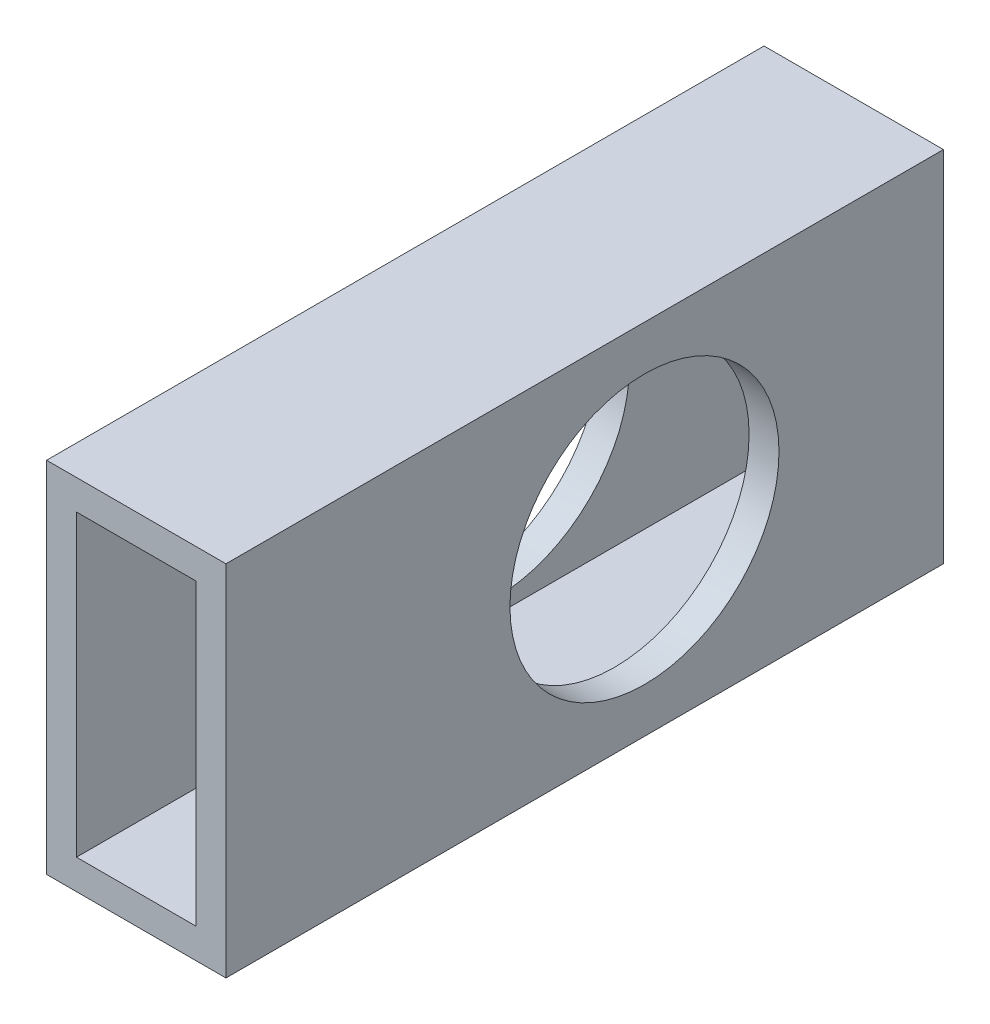
ISO-10303-21;
HEADER;
FILE_DESCRIPTION(('STEP AP214'),'2;1');
FILE_NAME('part.step','',(''),(''),'','','');
FILE_SCHEMA(('AUTOMOTIVE_DESIGN { 1 0 10303 214 1 1 1 1 }'));
ENDSEC;
DATA;
#1=APPLICATION_CONTEXT('core data for automotive mechanical design processes');
#2=APPLICATION_PROTOCOL_DEFINITION('international standard','automotive_design',2000,#1);
#3=PRODUCT_CONTEXT('',#1,'mechanical');
#4=PRODUCT('Part','Part','',(#3));
#5=PRODUCT_RELATED_PRODUCT_CATEGORY('part','',(#4));
#6=PRODUCT_DEFINITION_FORMATION('','',#4);
#7=PRODUCT_DEFINITION_CONTEXT('part definition',#1,'design');
#8=PRODUCT_DEFINITION('design','',#6,#7);
#9=PRODUCT_DEFINITION_SHAPE('','',#8);
#10=(LENGTH_UNIT() NAMED_UNIT(*) SI_UNIT(.MILLI.,.METRE.));
#11=(NAMED_UNIT(*) PLANE_ANGLE_UNIT() SI_UNIT($,.RADIAN.));
#12=(NAMED_UNIT(*) SI_UNIT($,.STERADIAN.) SOLID_ANGLE_UNIT());
#13=UNCERTAINTY_MEASURE_WITH_UNIT(LENGTH_MEASURE(1.E-05),#10,'distance_accuracy_value','');
#14=(GEOMETRIC_REPRESENTATION_CONTEXT(3) GLOBAL_UNCERTAINTY_ASSIGNED_CONTEXT((#13)) GLOBAL_UNIT_ASSIGNED_CONTEXT((#10,
#11,#12)) REPRESENTATION_CONTEXT('',''));
#15=CARTESIAN_POINT('',(0.,0.,0.));
#16=DIRECTION('',(0.,0.,1.));
#17=DIRECTION('',(1.,0.,0.));
#18=AXIS2_PLACEMENT_3D('',#15,#16,#17);
#19=CARTESIAN_POINT('',(0.,0.,76.2));
#20=DIRECTION('',(0.,0.,1.));
#21=DIRECTION('',(1.,0.,0.));
#22=AXIS2_PLACEMENT_3D('',#19,#20,#21);
#23=PLANE('',#22);
#24=DIRECTION('',(0.,-1.,0.));
#25=VECTOR('',#24,1.);
#26=CARTESIAN_POINT('',(0.,0.,76.2));
#27=LINE('',#26,#25);
#28=CARTESIAN_POINT('',(0.,38.1,76.2));
#29=VERTEX_POINT('',#28);
#30=CARTESIAN_POINT('',(0.,0.,76.2));
#31=VERTEX_POINT('',#30);
#32=EDGE_CURVE('E161',#29,#31,#27,.T.);
#33=ORIENTED_EDGE('',*,*,#32,.T.);
#34=DIRECTION('',(1.,0.,0.));
#35=VECTOR('',#34,1.);
#36=CARTESIAN_POINT('',(0.,0.,76.2));
#37=LINE('',#36,#35);
#38=CARTESIAN_POINT('',(19.05,0.,76.2));
#39=VERTEX_POINT('',#38);
#40=EDGE_CURVE('E164',#31,#39,#37,.T.);
#41=ORIENTED_EDGE('',*,*,#40,.T.);
#42=DIRECTION('',(0.,1.,0.));
#43=VECTOR('',#42,1.);
#44=CARTESIAN_POINT('',(19.05,0.,76.2));
#45=LINE('',#44,#43);
#46=CARTESIAN_POINT('',(19.05,38.1,76.2));
#47=VERTEX_POINT('',#46);
#48=EDGE_CURVE('E167',#39,#47,#45,.T.);
#49=ORIENTED_EDGE('',*,*,#48,.T.);
#50=DIRECTION('',(-1.,0.,0.));
#51=VECTOR('',#50,1.);
#52=CARTESIAN_POINT('',(0.,38.1,76.2));
#53=LINE('',#52,#51);
#54=EDGE_CURVE('E169',#47,#29,#53,.T.);
#55=ORIENTED_EDGE('',*,*,#54,.T.);
#56=EDGE_LOOP('',(#33,#41,#49,#55));
#57=FACE_BOUND('',#56,.T.);
#58=DIRECTION('',(1.,0.,0.));
#59=VECTOR('',#58,1.);
#60=CARTESIAN_POINT('',(0.,3.175,76.2));
#61=LINE('',#60,#59);
#62=CARTESIAN_POINT('',(3.175,3.175,76.2));
#63=VERTEX_POINT('',#62);
#64=CARTESIAN_POINT('',(15.875,3.175,76.2));
#65=VERTEX_POINT('',#64);
#66=EDGE_CURVE('E131',#63,#65,#61,.T.);
#67=ORIENTED_EDGE('',*,*,#66,.F.);
#68=DIRECTION('',(0.,-1.,0.));
#69=VECTOR('',#68,1.);
#70=CARTESIAN_POINT('',(3.175,0.,76.2));
#71=LINE('',#70,#69);
#72=CARTESIAN_POINT('',(3.175,34.925,76.2));
#73=VERTEX_POINT('',#72);
#74=EDGE_CURVE('E123',#73,#63,#71,.T.);
#75=ORIENTED_EDGE('',*,*,#74,.F.);
#76=DIRECTION('',(-1.,0.,0.));
#77=VECTOR('',#76,1.);
#78=CARTESIAN_POINT('',(0.,34.925,76.2));
#79=LINE('',#78,#77);
#80=CARTESIAN_POINT('',(15.875,34.925,76.2));
#81=VERTEX_POINT('',#80);
#82=EDGE_CURVE('E145',#81,#73,#79,.T.);
#83=ORIENTED_EDGE('',*,*,#82,.F.);
#84=DIRECTION('',(0.,1.,0.));
#85=VECTOR('',#84,1.);
#86=CARTESIAN_POINT('',(15.875,0.,76.2));
#87=LINE('',#86,#85);
#88=EDGE_CURVE('E143',#65,#81,#87,.T.);
#89=ORIENTED_EDGE('',*,*,#88,.F.);
#90=EDGE_LOOP('',(#67,#75,#83,#89));
#91=FACE_BOUND('',#90,.T.);
#92=ADVANCED_FACE('F57',(#57,#91),#23,.T.);
#93=CARTESIAN_POINT('',(0.,0.,0.));
#94=DIRECTION('',(0.,0.,1.));
#95=DIRECTION('',(1.,0.,0.));
#96=AXIS2_PLACEMENT_3D('',#93,#94,#95);
#97=PLANE('',#96);
#98=DIRECTION('',(0.,-1.,0.));
#99=VECTOR('',#98,1.);
#100=CARTESIAN_POINT('',(0.,0.,0.));
#101=LINE('',#100,#99);
#102=CARTESIAN_POINT('',(0.,38.1,0.));
#103=VERTEX_POINT('',#102);
#104=CARTESIAN_POINT('',(0.,0.,0.));
#105=VERTEX_POINT('',#104);
#106=EDGE_CURVE('E139',#103,#105,#101,.T.);
#107=ORIENTED_EDGE('',*,*,#106,.F.);
#108=DIRECTION('',(-1.,0.,0.));
#109=VECTOR('',#108,1.);
#110=CARTESIAN_POINT('',(0.,38.1,0.));
#111=LINE('',#110,#109);
#112=CARTESIAN_POINT('',(19.05,38.1,0.));
#113=VERTEX_POINT('',#112);
#114=EDGE_CURVE('E165',#113,#103,#111,.T.);
#115=ORIENTED_EDGE('',*,*,#114,.F.);
#116=DIRECTION('',(0.,1.,0.));
#117=VECTOR('',#116,1.);
#118=CARTESIAN_POINT('',(19.05,0.,0.));
#119=LINE('',#118,#117);
#120=CARTESIAN_POINT('',(19.05,0.,0.));
#121=VERTEX_POINT('',#120);
#122=EDGE_CURVE('E176',#121,#113,#119,.T.);
#123=ORIENTED_EDGE('',*,*,#122,.F.);
#124=DIRECTION('',(1.,0.,0.));
#125=VECTOR('',#124,1.);
#126=CARTESIAN_POINT('',(0.,0.,0.));
#127=LINE('',#126,#125);
#128=EDGE_CURVE('E174',#105,#121,#127,.T.);
#129=ORIENTED_EDGE('',*,*,#128,.F.);
#130=EDGE_LOOP('',(#107,#115,#123,#129));
#131=FACE_BOUND('',#130,.T.);
#132=DIRECTION('',(0.,-1.,0.));
#133=VECTOR('',#132,1.);
#134=CARTESIAN_POINT('',(3.175,0.,0.));
#135=LINE('',#134,#133);
#136=CARTESIAN_POINT('',(3.175,34.925,0.));
#137=VERTEX_POINT('',#136);
#138=CARTESIAN_POINT('',(3.175,3.175,0.));
#139=VERTEX_POINT('',#138);
#140=EDGE_CURVE('E81',#137,#139,#135,.T.);
#141=ORIENTED_EDGE('',*,*,#140,.T.);
#142=DIRECTION('',(1.,0.,0.));
#143=VECTOR('',#142,1.);
#144=CARTESIAN_POINT('',(0.,3.175,0.));
#145=LINE('',#144,#143);
#146=CARTESIAN_POINT('',(15.875,3.175,0.));
#147=VERTEX_POINT('',#146);
#148=EDGE_CURVE('E138',#139,#147,#145,.T.);
#149=ORIENTED_EDGE('',*,*,#148,.T.);
#150=DIRECTION('',(0.,1.,0.));
#151=VECTOR('',#150,1.);
#152=CARTESIAN_POINT('',(15.875,0.,0.));
#153=LINE('',#152,#151);
#154=CARTESIAN_POINT('',(15.875,34.925,0.));
#155=VERTEX_POINT('',#154);
#156=EDGE_CURVE('E153',#147,#155,#153,.T.);
#157=ORIENTED_EDGE('',*,*,#156,.T.);
#158=DIRECTION('',(-1.,0.,0.));
#159=VECTOR('',#158,1.);
#160=CARTESIAN_POINT('',(0.,34.925,0.));
#161=LINE('',#160,#159);
#162=EDGE_CURVE('E132',#155,#137,#161,.T.);
#163=ORIENTED_EDGE('',*,*,#162,.T.);
#164=EDGE_LOOP('',(#141,#149,#157,#163));
#165=FACE_BOUND('',#164,.T.);
#166=ADVANCED_FACE('F195',(#131,#165),#97,.F.);
#167=CARTESIAN_POINT('',(0.,0.,76.2));
#168=DIRECTION('',(1.,0.,0.));
#169=DIRECTION('',(0.,0.,-1.));
#170=AXIS2_PLACEMENT_3D('',#167,#168,#169);
#171=PLANE('',#170);
#172=CARTESIAN_POINT('',(0.,19.05,31.75));
#173=DIRECTION('',(1.,0.,0.));
#174=DIRECTION('',(0.,0.,-1.));
#175=AXIS2_PLACEMENT_3D('',#172,#173,#174);
#176=CIRCLE('',#175,14.2875);
#177=CARTESIAN_POINT('',(0.,19.05,17.4625));
#178=VERTEX_POINT('',#177);
#179=EDGE_CURVE('E236',#178,#178,#176,.T.);
#180=ORIENTED_EDGE('',*,*,#179,.T.);
#181=EDGE_LOOP('',(#180));
#182=FACE_BOUND('',#181,.T.);
#183=ORIENTED_EDGE('',*,*,#106,.T.);
#184=DIRECTION('',(0.,0.,-1.));
#185=VECTOR('',#184,1.);
#186=CARTESIAN_POINT('',(0.,0.,76.2));
#187=LINE('',#186,#185);
#188=EDGE_CURVE('E12',#31,#105,#187,.T.);
#189=ORIENTED_EDGE('',*,*,#188,.F.);
#190=ORIENTED_EDGE('',*,*,#32,.F.);
#191=DIRECTION('',(0.,0.,-1.));
#192=VECTOR('',#191,1.);
#193=CARTESIAN_POINT('',(0.,38.1,76.2));
#194=LINE('',#193,#192);
#195=EDGE_CURVE('E171',#29,#103,#194,.T.);
#196=ORIENTED_EDGE('',*,*,#195,.T.);
#197=EDGE_LOOP('',(#183,#189,#190,#196));
#198=FACE_BOUND('',#197,.T.);
#199=ADVANCED_FACE('F59',(#182,#198),#171,.F.);
#200=CARTESIAN_POINT('',(0.,0.,76.2));
#201=DIRECTION('',(0.,1.,0.));
#202=DIRECTION('',(0.,0.,1.));
#203=AXIS2_PLACEMENT_3D('',#200,#201,#202);
#204=PLANE('',#203);
#205=ORIENTED_EDGE('',*,*,#128,.T.);
#206=DIRECTION('',(0.,0.,-1.));
#207=VECTOR('',#206,1.);
#208=CARTESIAN_POINT('',(19.05,0.,76.2));
#209=LINE('',#208,#207);
#210=EDGE_CURVE('E66',#39,#121,#209,.T.);
#211=ORIENTED_EDGE('',*,*,#210,.F.);
#212=ORIENTED_EDGE('',*,*,#40,.F.);
#213=ORIENTED_EDGE('',*,*,#188,.T.);
#214=EDGE_LOOP('',(#205,#211,#212,#213));
#215=FACE_BOUND('',#214,.T.);
#216=ADVANCED_FACE('F205',(#215),#204,.F.);
#217=CARTESIAN_POINT('',(19.05,0.,76.2));
#218=DIRECTION('',(-1.,0.,0.));
#219=DIRECTION('',(0.,0.,1.));
#220=AXIS2_PLACEMENT_3D('',#217,#218,#219);
#221=PLANE('',#220);
#222=CARTESIAN_POINT('',(19.05,19.05,31.75));
#223=DIRECTION('',(1.,0.,0.));
#224=DIRECTION('',(0.,0.,-1.));
#225=AXIS2_PLACEMENT_3D('',#222,#223,#224);
#226=CIRCLE('',#225,14.2875);
#227=CARTESIAN_POINT('',(19.05,19.05,17.4625));
#228=VERTEX_POINT('',#227);
#229=EDGE_CURVE('E238',#228,#228,#226,.T.);
#230=ORIENTED_EDGE('',*,*,#229,.F.);
#231=EDGE_LOOP('',(#230));
#232=FACE_BOUND('',#231,.T.);
#233=ORIENTED_EDGE('',*,*,#122,.T.);
#234=DIRECTION('',(0.,0.,-1.));
#235=VECTOR('',#234,1.);
#236=CARTESIAN_POINT('',(19.05,38.1,76.2));
#237=LINE('',#236,#235);
#238=EDGE_CURVE('E181',#47,#113,#237,.T.);
#239=ORIENTED_EDGE('',*,*,#238,.F.);
#240=ORIENTED_EDGE('',*,*,#48,.F.);
#241=ORIENTED_EDGE('',*,*,#210,.T.);
#242=EDGE_LOOP('',(#233,#239,#240,#241));
#243=FACE_BOUND('',#242,.T.);
#244=ADVANCED_FACE('F189',(#232,#243),#221,.F.);
#245=CARTESIAN_POINT('',(0.,38.1,76.2));
#246=DIRECTION('',(0.,-1.,0.));
#247=DIRECTION('',(0.,0.,-1.));
#248=AXIS2_PLACEMENT_3D('',#245,#246,#247);
#249=PLANE('',#248);
#250=ORIENTED_EDGE('',*,*,#114,.T.);
#251=ORIENTED_EDGE('',*,*,#195,.F.);
#252=ORIENTED_EDGE('',*,*,#54,.F.);
#253=ORIENTED_EDGE('',*,*,#238,.T.);
#254=EDGE_LOOP('',(#250,#251,#252,#253));
#255=FACE_BOUND('',#254,.T.);
#256=ADVANCED_FACE('F199',(#255),#249,.F.);
#257=CARTESIAN_POINT('',(3.175,0.,76.2));
#258=DIRECTION('',(1.,0.,0.));
#259=DIRECTION('',(0.,0.,-1.));
#260=AXIS2_PLACEMENT_3D('',#257,#258,#259);
#261=PLANE('',#260);
#262=CARTESIAN_POINT('',(3.175,19.05,31.75));
#263=DIRECTION('',(1.,0.,0.));
#264=DIRECTION('',(0.,0.,-1.));
#265=AXIS2_PLACEMENT_3D('',#262,#263,#264);
#266=CIRCLE('',#265,14.2875);
#267=CARTESIAN_POINT('',(3.175,19.05,17.4625));
#268=VERTEX_POINT('',#267);
#269=EDGE_CURVE('E151',#268,#268,#266,.T.);
#270=ORIENTED_EDGE('',*,*,#269,.F.);
#271=EDGE_LOOP('',(#270));
#272=FACE_BOUND('',#271,.T.);
#273=ORIENTED_EDGE('',*,*,#140,.F.);
#274=DIRECTION('',(0.,0.,-1.));
#275=VECTOR('',#274,1.);
#276=CARTESIAN_POINT('',(3.175,34.925,76.2));
#277=LINE('',#276,#275);
#278=EDGE_CURVE('E127',#73,#137,#277,.T.);
#279=ORIENTED_EDGE('',*,*,#278,.F.);
#280=ORIENTED_EDGE('',*,*,#74,.T.);
#281=DIRECTION('',(0.,0.,-1.));
#282=VECTOR('',#281,1.);
#283=CARTESIAN_POINT('',(3.175,3.175,76.2));
#284=LINE('',#283,#282);
#285=EDGE_CURVE('E126',#63,#139,#284,.T.);
#286=ORIENTED_EDGE('',*,*,#285,.T.);
#287=EDGE_LOOP('',(#273,#279,#280,#286));
#288=FACE_BOUND('',#287,.T.);
#289=ADVANCED_FACE('F125',(#272,#288),#261,.T.);
#290=CARTESIAN_POINT('',(0.,3.175,76.2));
#291=DIRECTION('',(0.,1.,0.));
#292=DIRECTION('',(0.,0.,1.));
#293=AXIS2_PLACEMENT_3D('',#290,#291,#292);
#294=PLANE('',#293);
#295=ORIENTED_EDGE('',*,*,#148,.F.);
#296=ORIENTED_EDGE('',*,*,#285,.F.);
#297=ORIENTED_EDGE('',*,*,#66,.T.);
#298=DIRECTION('',(0.,0.,-1.));
#299=VECTOR('',#298,1.);
#300=CARTESIAN_POINT('',(15.875,3.175,76.2));
#301=LINE('',#300,#299);
#302=EDGE_CURVE('E140',#65,#147,#301,.T.);
#303=ORIENTED_EDGE('',*,*,#302,.T.);
#304=EDGE_LOOP('',(#295,#296,#297,#303));
#305=FACE_BOUND('',#304,.T.);
#306=ADVANCED_FACE('F135',(#305),#294,.T.);
#307=CARTESIAN_POINT('',(15.875,0.,76.2));
#308=DIRECTION('',(-1.,0.,0.));
#309=DIRECTION('',(0.,0.,1.));
#310=AXIS2_PLACEMENT_3D('',#307,#308,#309);
#311=PLANE('',#310);
#312=CARTESIAN_POINT('',(15.875,19.05,31.75));
#313=DIRECTION('',(-1.,0.,0.));
#314=DIRECTION('',(0.,0.,1.));
#315=AXIS2_PLACEMENT_3D('',#312,#313,#314);
#316=CIRCLE('',#315,14.2875);
#317=CARTESIAN_POINT('',(15.875,19.05,17.4625));
#318=VERTEX_POINT('',#317);
#319=EDGE_CURVE('E61',#318,#318,#316,.T.);
#320=ORIENTED_EDGE('',*,*,#319,.F.);
#321=EDGE_LOOP('',(#320));
#322=FACE_BOUND('',#321,.T.);
#323=ORIENTED_EDGE('',*,*,#156,.F.);
#324=ORIENTED_EDGE('',*,*,#302,.F.);
#325=ORIENTED_EDGE('',*,*,#88,.T.);
#326=DIRECTION('',(0.,0.,-1.));
#327=VECTOR('',#326,1.);
#328=CARTESIAN_POINT('',(15.875,34.925,76.2));
#329=LINE('',#328,#327);
#330=EDGE_CURVE('E73',#81,#155,#329,.T.);
#331=ORIENTED_EDGE('',*,*,#330,.T.);
#332=EDGE_LOOP('',(#323,#324,#325,#331));
#333=FACE_BOUND('',#332,.T.);
#334=ADVANCED_FACE('F231',(#322,#333),#311,.T.);
#335=CARTESIAN_POINT('',(0.,34.925,76.2));
#336=DIRECTION('',(0.,-1.,0.));
#337=DIRECTION('',(0.,0.,-1.));
#338=AXIS2_PLACEMENT_3D('',#335,#336,#337);
#339=PLANE('',#338);
#340=ORIENTED_EDGE('',*,*,#162,.F.);
#341=ORIENTED_EDGE('',*,*,#330,.F.);
#342=ORIENTED_EDGE('',*,*,#82,.T.);
#343=ORIENTED_EDGE('',*,*,#278,.T.);
#344=EDGE_LOOP('',(#340,#341,#342,#343));
#345=FACE_BOUND('',#344,.T.);
#346=ADVANCED_FACE('F251',(#345),#339,.T.);
#347=CARTESIAN_POINT('',(0.,19.05,31.75));
#348=DIRECTION('',(1.,0.,0.));
#349=DIRECTION('',(0.,0.,-1.));
#350=AXIS2_PLACEMENT_3D('',#347,#348,#349);
#351=CYLINDRICAL_SURFACE('',#350,14.2875);
#352=CARTESIAN_POINT('',(15.875,19.05,17.4625));
#353=CARTESIAN_POINT('',(15.9080729166667,19.05,17.4625));
#354=CARTESIAN_POINT('',(15.9411458333333,19.05,17.4625));
#355=CARTESIAN_POINT('',(16.0072916666667,19.05,17.4625));
#356=CARTESIAN_POINT('',(16.0403645833333,19.05,17.4625));
#357=CARTESIAN_POINT('',(16.1065104166667,19.05,17.4625));
#358=CARTESIAN_POINT('',(16.1395833333333,19.05,17.4625));
#359=CARTESIAN_POINT('',(16.2057291666667,19.05,17.4625));
#360=CARTESIAN_POINT('',(16.2388020833333,19.05,17.4625));
#361=CARTESIAN_POINT('',(16.3049479166667,19.05,17.4625));
#362=CARTESIAN_POINT('',(16.3380208333333,19.05,17.4625));
#363=CARTESIAN_POINT('',(16.4041666666667,19.05,17.4625));
#364=CARTESIAN_POINT('',(16.4372395833333,19.05,17.4625));
#365=CARTESIAN_POINT('',(16.5033854166667,19.05,17.4625));
#366=CARTESIAN_POINT('',(16.5364583333333,19.05,17.4625));
#367=CARTESIAN_POINT('',(16.6026041666667,19.05,17.4625));
#368=CARTESIAN_POINT('',(16.6356770833333,19.05,17.4625));
#369=CARTESIAN_POINT('',(16.7018229166667,19.05,17.4625));
#370=CARTESIAN_POINT('',(16.7348958333333,19.05,17.4625));
#371=CARTESIAN_POINT('',(16.8010416666667,19.05,17.4625));
#372=CARTESIAN_POINT('',(16.8341145833333,19.05,17.4625));
#373=CARTESIAN_POINT('',(16.9002604166667,19.05,17.4625));
#374=CARTESIAN_POINT('',(16.9333333333333,19.05,17.4625));
#375=CARTESIAN_POINT('',(16.9994791666667,19.05,17.4625));
#376=CARTESIAN_POINT('',(17.0325520833333,19.05,17.4625));
#377=CARTESIAN_POINT('',(17.0986979166667,19.05,17.4625));
#378=CARTESIAN_POINT('',(17.1317708333333,19.05,17.4625));
#379=CARTESIAN_POINT('',(17.1979166666667,19.05,17.4625));
#380=CARTESIAN_POINT('',(17.2309895833333,19.05,17.4625));
#381=CARTESIAN_POINT('',(17.2971354166667,19.05,17.4625));
#382=CARTESIAN_POINT('',(17.3302083333333,19.05,17.4625));
#383=CARTESIAN_POINT('',(17.3963541666667,19.05,17.4625));
#384=CARTESIAN_POINT('',(17.4294270833333,19.05,17.4625));
#385=CARTESIAN_POINT('',(17.4955729166667,19.05,17.4625));
#386=CARTESIAN_POINT('',(17.5286458333333,19.05,17.4625));
#387=CARTESIAN_POINT('',(17.5947916666667,19.05,17.4625));
#388=CARTESIAN_POINT('',(17.6278645833333,19.05,17.4625));
#389=CARTESIAN_POINT('',(17.6940104166667,19.05,17.4625));
#390=CARTESIAN_POINT('',(17.7270833333333,19.05,17.4625));
#391=CARTESIAN_POINT('',(17.7932291666667,19.05,17.4625));
#392=CARTESIAN_POINT('',(17.8263020833333,19.05,17.4625));
#393=CARTESIAN_POINT('',(17.8924479166667,19.05,17.4625));
#394=CARTESIAN_POINT('',(17.9255208333333,19.05,17.4625));
#395=CARTESIAN_POINT('',(17.9916666666667,19.05,17.4625));
#396=CARTESIAN_POINT('',(18.0247395833333,19.05,17.4625));
#397=CARTESIAN_POINT('',(18.0908854166667,19.05,17.4625));
#398=CARTESIAN_POINT('',(18.1239583333333,19.05,17.4625));
#399=CARTESIAN_POINT('',(18.1901041666667,19.05,17.4625));
#400=CARTESIAN_POINT('',(18.2231770833333,19.05,17.4625));
#401=CARTESIAN_POINT('',(18.2893229166667,19.05,17.4625));
#402=CARTESIAN_POINT('',(18.3223958333333,19.05,17.4625));
#403=CARTESIAN_POINT('',(18.3885416666667,19.05,17.4625));
#404=CARTESIAN_POINT('',(18.4216145833333,19.05,17.4625));
#405=CARTESIAN_POINT('',(18.4877604166667,19.05,17.4625));
#406=CARTESIAN_POINT('',(18.5208333333333,19.05,17.4625));
#407=CARTESIAN_POINT('',(18.5869791666667,19.05,17.4625));
#408=CARTESIAN_POINT('',(18.6200520833333,19.05,17.4625));
#409=CARTESIAN_POINT('',(18.6861979166667,19.05,17.4625));
#410=CARTESIAN_POINT('',(18.7192708333333,19.05,17.4625));
#411=CARTESIAN_POINT('',(18.7854166666667,19.05,17.4625));
#412=CARTESIAN_POINT('',(18.8184895833333,19.05,17.4625));
#413=CARTESIAN_POINT('',(18.8846354166667,19.05,17.4625));
#414=CARTESIAN_POINT('',(18.9177083333333,19.05,17.4625));
#415=CARTESIAN_POINT('',(18.9838541666667,19.05,17.4625));
#416=CARTESIAN_POINT('',(19.0169270833333,19.05,17.4625));
#417=CARTESIAN_POINT('',(19.05,19.05,17.4625));
#418=B_SPLINE_CURVE_WITH_KNOTS('',3,(#352,#353,#354,#355,#356,#357,#358,#359,#360,#361,#362,
#363,#364,#365,#366,#367,#368,#369,#370,#371,#372,#373,#374,#375,#376,#377,#378,#379,#380,#381,
#382,#383,#384,#385,#386,#387,#388,#389,#390,#391,#392,#393,#394,#395,#396,#397,#398,#399,#400,
#401,#402,#403,#404,#405,#406,#407,#408,#409,#410,#411,#412,#413,#414,#415,#416,#417),
.UNSPECIFIED.,.F.,.F.,(4,2,2,2,2,2,2,2,2,2,2,2,2,2,2,2,2,2,2,2,2,2,2,2,2,2,2,2,2,2,2,2,4),(0.,
0.0992187500000012,0.198437499999999,0.29765625,0.396875000000001,0.496093749999999,0.5953125,
0.694531250000002,0.793750000000003,0.892968750000001,0.992187500000002,1.09140625,1.190625,
1.28984375,1.3890625,1.48828125,1.5875,1.68671875,1.7859375,1.88515625,1.984375,2.08359375,
2.1828125,2.28203125,2.38125,2.48046875,2.5796875,2.67890625,2.778125,2.87734375,
2.97656250000001,3.07578125,3.175),.UNSPECIFIED.);
#419=EDGE_CURVE('BSEAM246',#318,#228,#418,.T.);
#420=ORIENTED_EDGE('',*,*,#319,.T.);
#421=ORIENTED_EDGE('',*,*,#229,.T.);
#422=ORIENTED_EDGE('',*,*,#419,.T.);
#423=ORIENTED_EDGE('',*,*,#419,.F.);
#424=EDGE_LOOP('',(#420,#422,#421,#423));
#425=FACE_BOUND('',#424,.T.);
#426=ADVANCED_FACE('F246',(#425),#351,.F.);
#427=CARTESIAN_POINT('',(3.175,19.05,17.4625));
#428=CARTESIAN_POINT('',(3.14192708333333,19.05,17.4625));
#429=CARTESIAN_POINT('',(3.10885416666667,19.05,17.4625));
#430=CARTESIAN_POINT('',(3.04270833333333,19.05,17.4625));
#431=CARTESIAN_POINT('',(3.00963541666667,19.05,17.4625));
#432=CARTESIAN_POINT('',(2.94348958333333,19.05,17.4625));
#433=CARTESIAN_POINT('',(2.91041666666667,19.05,17.4625));
#434=CARTESIAN_POINT('',(2.84427083333333,19.05,17.4625));
#435=CARTESIAN_POINT('',(2.81119791666667,19.05,17.4625));
#436=CARTESIAN_POINT('',(2.74505208333333,19.05,17.4625));
#437=CARTESIAN_POINT('',(2.71197916666667,19.05,17.4625));
#438=CARTESIAN_POINT('',(2.64583333333333,19.05,17.4625));
#439=CARTESIAN_POINT('',(2.61276041666667,19.05,17.4625));
#440=CARTESIAN_POINT('',(2.54661458333333,19.05,17.4625));
#441=CARTESIAN_POINT('',(2.51354166666667,19.05,17.4625));
#442=CARTESIAN_POINT('',(2.44739583333333,19.05,17.4625));
#443=CARTESIAN_POINT('',(2.41432291666667,19.05,17.4625));
#444=CARTESIAN_POINT('',(2.34817708333333,19.05,17.4625));
#445=CARTESIAN_POINT('',(2.31510416666667,19.05,17.4625));
#446=CARTESIAN_POINT('',(2.24895833333333,19.05,17.4625));
#447=CARTESIAN_POINT('',(2.21588541666667,19.05,17.4625));
#448=CARTESIAN_POINT('',(2.14973958333333,19.05,17.4625));
#449=CARTESIAN_POINT('',(2.11666666666667,19.05,17.4625));
#450=CARTESIAN_POINT('',(2.05052083333333,19.05,17.4625));
#451=CARTESIAN_POINT('',(2.01744791666667,19.05,17.4625));
#452=CARTESIAN_POINT('',(1.95130208333333,19.05,17.4625));
#453=CARTESIAN_POINT('',(1.91822916666667,19.05,17.4625));
#454=CARTESIAN_POINT('',(1.85208333333333,19.05,17.4625));
#455=CARTESIAN_POINT('',(1.81901041666667,19.05,17.4625));
#456=CARTESIAN_POINT('',(1.75286458333333,19.05,17.4625));
#457=CARTESIAN_POINT('',(1.71979166666667,19.05,17.4625));
#458=CARTESIAN_POINT('',(1.65364583333333,19.05,17.4625));
#459=CARTESIAN_POINT('',(1.62057291666667,19.05,17.4625));
#460=CARTESIAN_POINT('',(1.55442708333333,19.05,17.4625));
#461=CARTESIAN_POINT('',(1.52135416666667,19.05,17.4625));
#462=CARTESIAN_POINT('',(1.45520833333333,19.05,17.4625));
#463=CARTESIAN_POINT('',(1.42213541666667,19.05,17.4625));
#464=CARTESIAN_POINT('',(1.35598958333333,19.05,17.4625));
#465=CARTESIAN_POINT('',(1.32291666666667,19.05,17.4625));
#466=CARTESIAN_POINT('',(1.25677083333333,19.05,17.4625));
#467=CARTESIAN_POINT('',(1.22369791666667,19.05,17.4625));
#468=CARTESIAN_POINT('',(1.15755208333333,19.05,17.4625));
#469=CARTESIAN_POINT('',(1.12447916666667,19.05,17.4625));
#470=CARTESIAN_POINT('',(1.05833333333333,19.05,17.4625));
#471=CARTESIAN_POINT('',(1.02526041666667,19.05,17.4625));
#472=CARTESIAN_POINT('',(0.959114583333333,19.05,17.4625));
#473=CARTESIAN_POINT('',(0.926041666666667,19.05,17.4625));
#474=CARTESIAN_POINT('',(0.859895833333333,19.05,17.4625));
#475=CARTESIAN_POINT('',(0.826822916666667,19.05,17.4625));
#476=CARTESIAN_POINT('',(0.760677083333333,19.05,17.4625));
#477=CARTESIAN_POINT('',(0.727604166666666,19.05,17.4625));
#478=CARTESIAN_POINT('',(0.661458333333333,19.05,17.4625));
#479=CARTESIAN_POINT('',(0.628385416666666,19.05,17.4625));
#480=CARTESIAN_POINT('',(0.562239583333333,19.05,17.4625));
#481=CARTESIAN_POINT('',(0.529166666666666,19.05,17.4625));
#482=CARTESIAN_POINT('',(0.463020833333333,19.05,17.4625));
#483=CARTESIAN_POINT('',(0.429947916666667,19.05,17.4625));
#484=CARTESIAN_POINT('',(0.363802083333333,19.05,17.4625));
#485=CARTESIAN_POINT('',(0.330729166666667,19.05,17.4625));
#486=CARTESIAN_POINT('',(0.264583333333333,19.05,17.4625));
#487=CARTESIAN_POINT('',(0.231510416666667,19.05,17.4625));
#488=CARTESIAN_POINT('',(0.165364583333333,19.05,17.4625));
#489=CARTESIAN_POINT('',(0.132291666666667,19.05,17.4625));
#490=CARTESIAN_POINT('',(0.0661458333333333,19.05,17.4625));
#491=CARTESIAN_POINT('',(0.0330729166666666,19.05,17.4625));
#492=CARTESIAN_POINT('',(0.,19.05,17.4625));
#493=B_SPLINE_CURVE_WITH_KNOTS('',3,(#427,#428,#429,#430,#431,#432,#433,#434,#435,#436,#437,
#438,#439,#440,#441,#442,#443,#444,#445,#446,#447,#448,#449,#450,#451,#452,#453,#454,#455,#456,
#457,#458,#459,#460,#461,#462,#463,#464,#465,#466,#467,#468,#469,#470,#471,#472,#473,#474,#475,
#476,#477,#478,#479,#480,#481,#482,#483,#484,#485,#486,#487,#488,#489,#490,#491,#492),
.UNSPECIFIED.,.F.,.F.,(4,2,2,2,2,2,2,2,2,2,2,2,2,2,2,2,2,2,2,2,2,2,2,2,2,2,2,2,2,2,2,2,4),(0.,
0.0992187499999999,0.1984375,0.29765625,0.396875,0.49609375,0.5953125,0.69453125,0.79375,
0.89296875,0.9921875,1.09140625,1.190625,1.28984375,1.3890625,1.48828125,1.5875,1.68671875,
1.7859375,1.88515625,1.984375,2.08359375,2.1828125,2.28203125,2.38125,2.48046875,2.5796875,
2.67890625,2.778125,2.87734375,2.9765625,3.07578125,3.175),.UNSPECIFIED.);
#494=EDGE_CURVE('BSEAM244',#268,#178,#493,.T.);
#495=ORIENTED_EDGE('',*,*,#269,.T.);
#496=ORIENTED_EDGE('',*,*,#179,.F.);
#497=ORIENTED_EDGE('',*,*,#494,.T.);
#498=ORIENTED_EDGE('',*,*,#494,.F.);
#499=EDGE_LOOP('',(#495,#497,#496,#498));
#500=FACE_BOUND('',#499,.T.);
#501=ADVANCED_FACE('F244',(#500),#351,.F.);
#502=CLOSED_SHELL('',(#92,#166,#199,#216,#244,#256,#289,#306,#334,#346,#426,#501));
#503=MANIFOLD_SOLID_BREP('B2',#502);
#504=ADVANCED_BREP_SHAPE_REPRESENTATION('',(#18,#503),#14);
#505=SHAPE_DEFINITION_REPRESENTATION(#9,#504);
ENDSEC;
END-ISO-10303-21;
